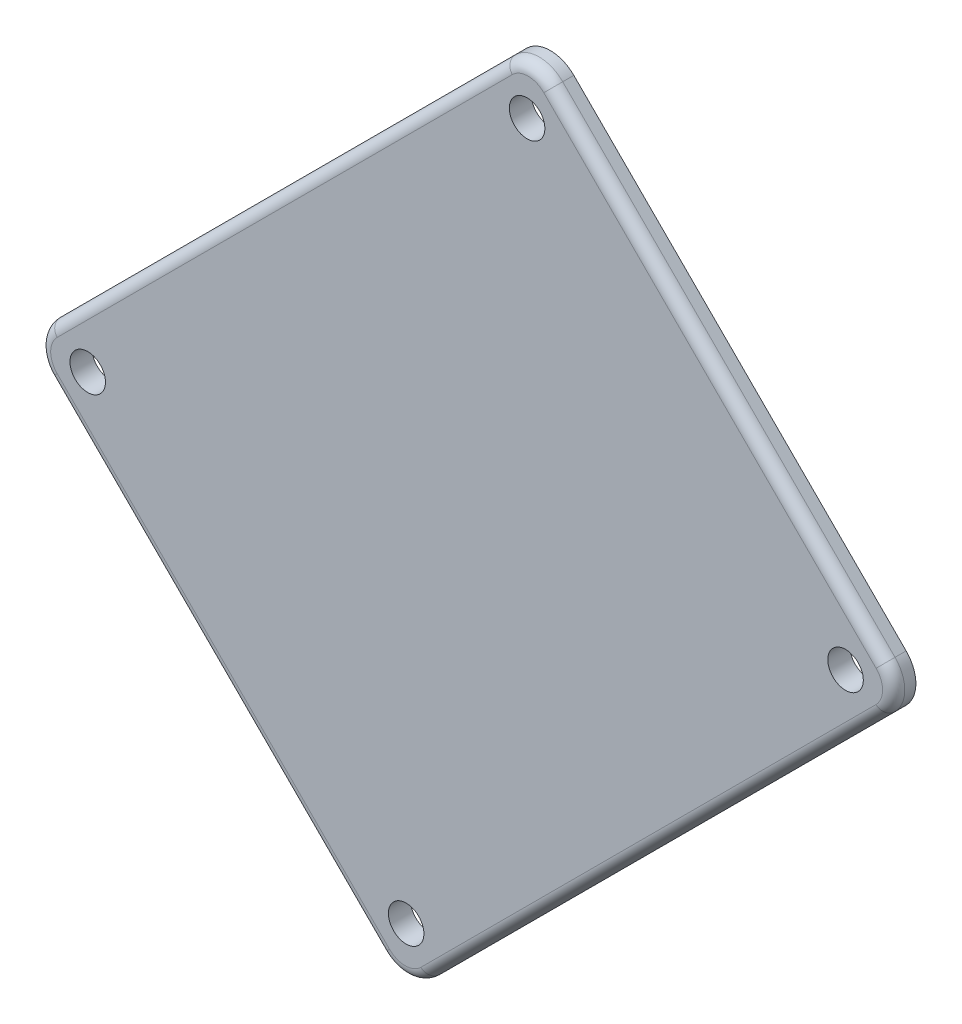
ISO-10303-21;
HEADER;
FILE_DESCRIPTION(('STEP AP214'),'2;1');
FILE_NAME('part.step','',(''),(''),'','','');
FILE_SCHEMA(('AUTOMOTIVE_DESIGN { 1 0 10303 214 1 1 1 1 }'));
ENDSEC;
DATA;
#1=APPLICATION_CONTEXT('core data for automotive mechanical design processes');
#2=APPLICATION_PROTOCOL_DEFINITION('international standard','automotive_design',2000,#1);
#3=PRODUCT_CONTEXT('',#1,'mechanical');
#4=PRODUCT('Part','Part','',(#3));
#5=PRODUCT_RELATED_PRODUCT_CATEGORY('part','',(#4));
#6=PRODUCT_DEFINITION_FORMATION('','',#4);
#7=PRODUCT_DEFINITION_CONTEXT('part definition',#1,'design');
#8=PRODUCT_DEFINITION('design','',#6,#7);
#9=PRODUCT_DEFINITION_SHAPE('','',#8);
#10=(LENGTH_UNIT() NAMED_UNIT(*) SI_UNIT(.MILLI.,.METRE.));
#11=(NAMED_UNIT(*) PLANE_ANGLE_UNIT() SI_UNIT($,.RADIAN.));
#12=(NAMED_UNIT(*) SI_UNIT($,.STERADIAN.) SOLID_ANGLE_UNIT());
#13=UNCERTAINTY_MEASURE_WITH_UNIT(LENGTH_MEASURE(1.E-05),#10,'distance_accuracy_value','');
#14=(GEOMETRIC_REPRESENTATION_CONTEXT(3) GLOBAL_UNCERTAINTY_ASSIGNED_CONTEXT((#13)) GLOBAL_UNIT_ASSIGNED_CONTEXT((#10,
#11,#12)) REPRESENTATION_CONTEXT('',''));
#15=CARTESIAN_POINT('',(0.,0.,0.));
#16=DIRECTION('',(0.,0.,1.));
#17=DIRECTION('',(1.,0.,0.));
#18=AXIS2_PLACEMENT_3D('',#15,#16,#17);
#19=CARTESIAN_POINT('',(-66.6519516090227,14.1305082810714,1.));
#20=DIRECTION('',(0.,0.,-1.));
#21=DIRECTION('',(-1.,0.,0.));
#22=AXIS2_PLACEMENT_3D('',#19,#20,#21);
#23=TOROIDAL_SURFACE('',#22,2.,1.);
#24=CARTESIAN_POINT('',(-68.0661651713958,15.5447218434445,1.));
#25=DIRECTION('',(-0.707106781186539,-0.707106781186556,0.));
#26=DIRECTION('',(0.707106781186556,-0.707106781186539,0.));
#27=AXIS2_PLACEMENT_3D('',#24,#25,#26);
#28=CIRCLE('',#27,1.);
#29=CARTESIAN_POINT('',(-68.0661651713958,15.5447218434445,2.));
#30=VERTEX_POINT('',#29);
#31=CARTESIAN_POINT('',(-68.7732719525824,16.251828624631,1.));
#32=VERTEX_POINT('',#31);
#33=EDGE_CURVE('E11',#30,#32,#28,.T.);
#34=ORIENTED_EDGE('',*,*,#33,.F.);
#35=CARTESIAN_POINT('',(-66.6519516090227,14.1305082810714,2.));
#36=DIRECTION('',(0.,0.,-1.));
#37=DIRECTION('',(-1.,0.,0.));
#38=AXIS2_PLACEMENT_3D('',#35,#36,#37);
#39=CIRCLE('',#38,2.);
#40=CARTESIAN_POINT('',(-65.2377380466496,15.5447218434445,2.));
#41=VERTEX_POINT('',#40);
#42=EDGE_CURVE('E140',#41,#30,#39,.F.);
#43=ORIENTED_EDGE('',*,*,#42,.F.);
#44=CARTESIAN_POINT('',(-65.2377380466496,15.5447218434444,1.));
#45=DIRECTION('',(-0.707106781186549,0.707106781186546,0.));
#46=DIRECTION('',(-0.707106781186546,-0.707106781186549,0.));
#47=AXIS2_PLACEMENT_3D('',#44,#45,#46);
#48=CIRCLE('',#47,1.);
#49=CARTESIAN_POINT('',(-64.5306312654631,16.251828624631,1.));
#50=VERTEX_POINT('',#49);
#51=EDGE_CURVE('E46',#41,#50,#48,.T.);
#52=ORIENTED_EDGE('',*,*,#51,.T.);
#53=CARTESIAN_POINT('',(-66.6519516090227,14.1305082810714,1.));
#54=DIRECTION('',(0.,0.,-1.));
#55=DIRECTION('',(-1.,0.,0.));
#56=AXIS2_PLACEMENT_3D('',#53,#54,#55);
#57=CIRCLE('',#56,3.);
#58=EDGE_CURVE('E232',#32,#50,#57,.T.);
#59=ORIENTED_EDGE('',*,*,#58,.F.);
#60=EDGE_LOOP('',(#34,#43,#52,#59));
#61=FACE_BOUND('',#60,.T.);
#62=ADVANCED_FACE('F39',(#61),#23,.T.);
#63=CARTESIAN_POINT('',(-65.2377380466496,15.5447218434445,1.));
#64=DIRECTION('',(-0.707106781186548,0.707106781186548,0.));
#65=DIRECTION('',(-0.707106781186548,-0.707106781186548,0.));
#66=AXIS2_PLACEMENT_3D('',#63,#64,#65);
#67=CYLINDRICAL_SURFACE('',#66,1.);
#68=ORIENTED_EDGE('',*,*,#51,.F.);
#69=DIRECTION('',(-0.707106781186548,0.707106781186548,0.));
#70=VECTOR('',#69,1.);
#71=CARTESIAN_POINT('',(-65.2377380466496,15.5447218434445,2.));
#72=LINE('',#71,#70);
#73=CARTESIAN_POINT('',(-35.2988369312113,-14.3941792719939,2.));
#74=VERTEX_POINT('',#73);
#75=EDGE_CURVE('E194',#74,#41,#72,.T.);
#76=ORIENTED_EDGE('',*,*,#75,.F.);
#77=CARTESIAN_POINT('',(-35.2988369312113,-14.3941792719939,1.));
#78=DIRECTION('',(-0.707106781186551,0.707106781186544,0.));
#79=DIRECTION('',(-0.707106781186544,-0.707106781186551,0.));
#80=AXIS2_PLACEMENT_3D('',#77,#78,#79);
#81=CIRCLE('',#80,1.);
#82=CARTESIAN_POINT('',(-34.5917301500247,-13.6870724908074,1.));
#83=VERTEX_POINT('',#82);
#84=EDGE_CURVE('E60',#74,#83,#81,.T.);
#85=ORIENTED_EDGE('',*,*,#84,.T.);
#86=DIRECTION('',(-0.707106781186548,0.707106781186548,0.));
#87=VECTOR('',#86,1.);
#88=CARTESIAN_POINT('',(-34.5917301500247,-13.6870724908074,1.));
#89=LINE('',#88,#87);
#90=EDGE_CURVE('E230',#50,#83,#89,.F.);
#91=ORIENTED_EDGE('',*,*,#90,.F.);
#92=EDGE_LOOP('',(#68,#76,#85,#91));
#93=FACE_BOUND('',#92,.T.);
#94=ADVANCED_FACE('F266',(#93),#67,.T.);
#95=CARTESIAN_POINT('',(-36.7130504935843,-15.808392834367,1.));
#96=DIRECTION('',(0.,0.,-1.));
#97=DIRECTION('',(-1.,0.,0.));
#98=AXIS2_PLACEMENT_3D('',#95,#96,#97);
#99=TOROIDAL_SURFACE('',#98,2.,1.);
#100=ORIENTED_EDGE('',*,*,#84,.F.);
#101=CARTESIAN_POINT('',(-36.7130504935843,-15.808392834367,2.));
#102=DIRECTION('',(0.,0.,-1.));
#103=DIRECTION('',(-1.,0.,0.));
#104=AXIS2_PLACEMENT_3D('',#101,#102,#103);
#105=CIRCLE('',#104,2.);
#106=CARTESIAN_POINT('',(-35.2988369312113,-17.2226063967401,2.));
#107=VERTEX_POINT('',#106);
#108=EDGE_CURVE('E197',#107,#74,#105,.F.);
#109=ORIENTED_EDGE('',*,*,#108,.F.);
#110=CARTESIAN_POINT('',(-35.2988369312113,-17.2226063967401,1.));
#111=DIRECTION('',(0.707106781186549,0.707106781186546,0.));
#112=DIRECTION('',(-0.707106781186546,0.707106781186549,0.));
#113=AXIS2_PLACEMENT_3D('',#110,#111,#112);
#114=CIRCLE('',#113,1.);
#115=CARTESIAN_POINT('',(-34.5917301500247,-17.9297131779267,1.));
#116=VERTEX_POINT('',#115);
#117=EDGE_CURVE('E242',#107,#116,#114,.T.);
#118=ORIENTED_EDGE('',*,*,#117,.T.);
#119=CARTESIAN_POINT('',(-36.7130504935843,-15.808392834367,1.));
#120=DIRECTION('',(0.,0.,-1.));
#121=DIRECTION('',(-1.,0.,0.));
#122=AXIS2_PLACEMENT_3D('',#119,#120,#121);
#123=CIRCLE('',#122,3.);
#124=EDGE_CURVE('E227',#83,#116,#123,.T.);
#125=ORIENTED_EDGE('',*,*,#124,.F.);
#126=EDGE_LOOP('',(#100,#109,#118,#125));
#127=FACE_BOUND('',#126,.T.);
#128=ADVANCED_FACE('F247',(#127),#99,.T.);
#129=CARTESIAN_POINT('',(-76.3110302400311,-58.2347997055599,1.));
#130=DIRECTION('',(0.707106781186547,0.707106781186548,0.));
#131=DIRECTION('',(-0.707106781186548,0.707106781186547,0.));
#132=AXIS2_PLACEMENT_3D('',#129,#130,#131);
#133=CYLINDRICAL_SURFACE('',#132,1.);
#134=ORIENTED_EDGE('',*,*,#117,.F.);
#135=DIRECTION('',(0.707106781186547,0.707106781186548,0.));
#136=VECTOR('',#135,1.);
#137=CARTESIAN_POINT('',(-76.3110302400311,-58.2347997055599,2.));
#138=LINE('',#137,#136);
#139=CARTESIAN_POINT('',(-76.311030240031,-58.2347997055599,2.));
#140=VERTEX_POINT('',#139);
#141=EDGE_CURVE('E200',#140,#107,#138,.T.);
#142=ORIENTED_EDGE('',*,*,#141,.F.);
#143=CARTESIAN_POINT('',(-76.311030240031,-58.2347997055599,1.));
#144=DIRECTION('',(0.707106781186548,0.707106781186548,0.));
#145=DIRECTION('',(-0.707106781186548,0.707106781186548,0.));
#146=AXIS2_PLACEMENT_3D('',#143,#144,#145);
#147=CIRCLE('',#146,1.);
#148=CARTESIAN_POINT('',(-75.6039234588445,-58.9419064867464,1.));
#149=VERTEX_POINT('',#148);
#150=EDGE_CURVE('E240',#140,#149,#147,.T.);
#151=ORIENTED_EDGE('',*,*,#150,.T.);
#152=DIRECTION('',(0.707106781186547,0.707106781186548,0.));
#153=VECTOR('',#152,1.);
#154=CARTESIAN_POINT('',(-75.6039234588445,-58.9419064867464,1.));
#155=LINE('',#154,#153);
#156=EDGE_CURVE('E224',#116,#149,#155,.F.);
#157=ORIENTED_EDGE('',*,*,#156,.F.);
#158=EDGE_LOOP('',(#134,#142,#151,#157));
#159=FACE_BOUND('',#158,.T.);
#160=ADVANCED_FACE('F255',(#159),#133,.T.);
#161=CARTESIAN_POINT('',(-77.7252438024041,-56.8205861431868,1.));
#162=DIRECTION('',(0.,0.,-1.));
#163=DIRECTION('',(-1.,0.,0.));
#164=AXIS2_PLACEMENT_3D('',#161,#162,#163);
#165=TOROIDAL_SURFACE('',#164,2.,1.);
#166=ORIENTED_EDGE('',*,*,#150,.F.);
#167=CARTESIAN_POINT('',(-77.7252438024041,-56.8205861431868,2.));
#168=DIRECTION('',(0.,0.,-1.));
#169=DIRECTION('',(-1.,0.,0.));
#170=AXIS2_PLACEMENT_3D('',#167,#168,#169);
#171=CIRCLE('',#170,2.);
#172=CARTESIAN_POINT('',(-79.1394573647772,-58.2347997055599,2.));
#173=VERTEX_POINT('',#172);
#174=EDGE_CURVE('E203',#173,#140,#171,.F.);
#175=ORIENTED_EDGE('',*,*,#174,.F.);
#176=CARTESIAN_POINT('',(-79.1394573647772,-58.2347997055599,1.));
#177=DIRECTION('',(0.707106781186548,-0.707106781186548,0.));
#178=DIRECTION('',(0.707106781186548,0.707106781186548,0.));
#179=AXIS2_PLACEMENT_3D('',#176,#177,#178);
#180=CIRCLE('',#179,1.);
#181=CARTESIAN_POINT('',(-79.8465641459638,-58.9419064867464,1.));
#182=VERTEX_POINT('',#181);
#183=EDGE_CURVE('E238',#173,#182,#180,.T.);
#184=ORIENTED_EDGE('',*,*,#183,.T.);
#185=CARTESIAN_POINT('',(-77.7252438024041,-56.8205861431868,1.));
#186=DIRECTION('',(0.,0.,-1.));
#187=DIRECTION('',(-1.,0.,0.));
#188=AXIS2_PLACEMENT_3D('',#185,#186,#187);
#189=CIRCLE('',#188,3.);
#190=EDGE_CURVE('E221',#149,#182,#189,.T.);
#191=ORIENTED_EDGE('',*,*,#190,.F.);
#192=EDGE_LOOP('',(#166,#175,#184,#191));
#193=FACE_BOUND('',#192,.T.);
#194=ADVANCED_FACE('F282',(#193),#165,.T.);
#195=CARTESIAN_POINT('',(-109.078358480216,-28.2958985901216,1.));
#196=DIRECTION('',(0.707106781186548,-0.707106781186547,0.));
#197=DIRECTION('',(0.707106781186547,0.707106781186548,0.));
#198=AXIS2_PLACEMENT_3D('',#195,#196,#197);
#199=CYLINDRICAL_SURFACE('',#198,1.);
#200=ORIENTED_EDGE('',*,*,#183,.F.);
#201=DIRECTION('',(0.707106781186548,-0.707106781186547,0.));
#202=VECTOR('',#201,1.);
#203=CARTESIAN_POINT('',(-109.078358480216,-28.2958985901216,2.));
#204=LINE('',#203,#202);
#205=CARTESIAN_POINT('',(-109.078358480216,-28.2958985901216,2.));
#206=VERTEX_POINT('',#205);
#207=EDGE_CURVE('E206',#206,#173,#204,.T.);
#208=ORIENTED_EDGE('',*,*,#207,.F.);
#209=CARTESIAN_POINT('',(-109.078358480216,-28.2958985901216,1.));
#210=DIRECTION('',(0.707106781186553,-0.707106781186542,0.));
#211=DIRECTION('',(0.707106781186542,0.707106781186553,0.));
#212=AXIS2_PLACEMENT_3D('',#209,#210,#211);
#213=CIRCLE('',#212,1.);
#214=CARTESIAN_POINT('',(-109.785465261402,-29.0030053713081,1.));
#215=VERTEX_POINT('',#214);
#216=EDGE_CURVE('E236',#206,#215,#213,.T.);
#217=ORIENTED_EDGE('',*,*,#216,.T.);
#218=DIRECTION('',(0.707106781186548,-0.707106781186547,0.));
#219=VECTOR('',#218,1.);
#220=CARTESIAN_POINT('',(-79.8465641459638,-58.9419064867464,1.));
#221=LINE('',#220,#219);
#222=EDGE_CURVE('E135',#182,#215,#221,.F.);
#223=ORIENTED_EDGE('',*,*,#222,.F.);
#224=EDGE_LOOP('',(#200,#208,#217,#223));
#225=FACE_BOUND('',#224,.T.);
#226=ADVANCED_FACE('F279',(#225),#199,.T.);
#227=CARTESIAN_POINT('',(-107.664144917843,-26.8816850277485,1.));
#228=DIRECTION('',(0.,0.,-1.));
#229=DIRECTION('',(-1.,0.,0.));
#230=AXIS2_PLACEMENT_3D('',#227,#228,#229);
#231=TOROIDAL_SURFACE('',#230,2.,1.);
#232=ORIENTED_EDGE('',*,*,#216,.F.);
#233=CARTESIAN_POINT('',(-107.664144917843,-26.8816850277485,2.));
#234=DIRECTION('',(0.,0.,-1.));
#235=DIRECTION('',(-1.,0.,0.));
#236=AXIS2_PLACEMENT_3D('',#233,#234,#235);
#237=CIRCLE('',#236,2.);
#238=CARTESIAN_POINT('',(-109.078358480216,-25.4674714653754,2.));
#239=VERTEX_POINT('',#238);
#240=EDGE_CURVE('E209',#239,#206,#237,.F.);
#241=ORIENTED_EDGE('',*,*,#240,.F.);
#242=CARTESIAN_POINT('',(-109.078358480216,-25.4674714653754,1.));
#243=DIRECTION('',(-0.707106781186549,-0.707106781186546,0.));
#244=DIRECTION('',(0.707106781186546,-0.707106781186549,0.));
#245=AXIS2_PLACEMENT_3D('',#242,#243,#244);
#246=CIRCLE('',#245,1.);
#247=CARTESIAN_POINT('',(-109.785465261402,-24.7603646841888,1.));
#248=VERTEX_POINT('',#247);
#249=EDGE_CURVE('E234',#239,#248,#246,.T.);
#250=ORIENTED_EDGE('',*,*,#249,.T.);
#251=CARTESIAN_POINT('',(-107.664144917843,-26.8816850277485,1.));
#252=DIRECTION('',(0.,0.,-1.));
#253=DIRECTION('',(-1.,0.,0.));
#254=AXIS2_PLACEMENT_3D('',#251,#252,#253);
#255=CIRCLE('',#254,3.);
#256=EDGE_CURVE('E218',#215,#248,#255,.T.);
#257=ORIENTED_EDGE('',*,*,#256,.F.);
#258=EDGE_LOOP('',(#232,#241,#250,#257));
#259=FACE_BOUND('',#258,.T.);
#260=ADVANCED_FACE('F277',(#259),#231,.T.);
#261=CARTESIAN_POINT('',(-109.078358480216,-25.4674714653754,1.));
#262=DIRECTION('',(-0.707106781186547,-0.707106781186548,0.));
#263=DIRECTION('',(0.707106781186548,-0.707106781186547,0.));
#264=AXIS2_PLACEMENT_3D('',#261,#262,#263);
#265=CYLINDRICAL_SURFACE('',#264,1.);
#266=DIRECTION('',(-0.707106781186547,-0.707106781186548,0.));
#267=VECTOR('',#266,1.);
#268=CARTESIAN_POINT('',(-109.078358480216,-25.4674714653754,2.));
#269=LINE('',#268,#267);
#270=EDGE_CURVE('E212',#30,#239,#269,.T.);
#271=ORIENTED_EDGE('',*,*,#270,.F.);
#272=ORIENTED_EDGE('',*,*,#33,.T.);
#273=DIRECTION('',(-0.707106781186547,-0.707106781186548,0.));
#274=VECTOR('',#273,1.);
#275=CARTESIAN_POINT('',(-109.785465261402,-24.7603646841888,1.));
#276=LINE('',#275,#274);
#277=EDGE_CURVE('E215',#248,#32,#276,.F.);
#278=ORIENTED_EDGE('',*,*,#277,.F.);
#279=ORIENTED_EDGE('',*,*,#249,.F.);
#280=EDGE_LOOP('',(#271,#272,#278,#279));
#281=FACE_BOUND('',#280,.T.);
#282=ADVANCED_FACE('F273',(#281),#265,.T.);
#283=CARTESIAN_POINT('',(-107.664144917843,-26.8816850277485,2.));
#284=DIRECTION('',(0.,0.,-1.));
#285=DIRECTION('',(-1.,0.,0.));
#286=AXIS2_PLACEMENT_3D('',#283,#284,#285);
#287=CYLINDRICAL_SURFACE('',#286,3.);
#288=DIRECTION('',(0.,0.,-1.));
#289=VECTOR('',#288,1.);
#290=CARTESIAN_POINT('',(-109.785465261402,-29.0030053713081,2.));
#291=LINE('',#290,#289);
#292=CARTESIAN_POINT('',(-109.785465261402,-29.0030053713081,0.));
#293=VERTEX_POINT('',#292);
#294=EDGE_CURVE('E128',#215,#293,#291,.T.);
#295=ORIENTED_EDGE('',*,*,#294,.F.);
#296=ORIENTED_EDGE('',*,*,#256,.T.);
#297=DIRECTION('',(0.,0.,-1.));
#298=VECTOR('',#297,1.);
#299=CARTESIAN_POINT('',(-109.785465261402,-24.7603646841888,2.));
#300=LINE('',#299,#298);
#301=CARTESIAN_POINT('',(-109.785465261402,-24.7603646841888,0.));
#302=VERTEX_POINT('',#301);
#303=EDGE_CURVE('E154',#248,#302,#300,.T.);
#304=ORIENTED_EDGE('',*,*,#303,.T.);
#305=CARTESIAN_POINT('',(-107.664144917843,-26.8816850277485,0.));
#306=DIRECTION('',(0.,0.,1.));
#307=DIRECTION('',(-1.,0.,0.));
#308=AXIS2_PLACEMENT_3D('',#305,#306,#307);
#309=CIRCLE('',#308,3.);
#310=EDGE_CURVE('E147',#302,#293,#309,.T.);
#311=ORIENTED_EDGE('',*,*,#310,.T.);
#312=EDGE_LOOP('',(#295,#296,#304,#311));
#313=FACE_BOUND('',#312,.T.);
#314=ADVANCED_FACE('F152',(#313),#287,.T.);
#315=CARTESIAN_POINT('',(-79.8465641459638,-58.9419064867464,2.));
#316=DIRECTION('',(0.707106781186547,0.707106781186548,0.));
#317=DIRECTION('',(-0.707106781186548,0.707106781186547,0.));
#318=AXIS2_PLACEMENT_3D('',#315,#316,#317);
#319=PLANE('',#318);
#320=DIRECTION('',(0.,0.,-1.));
#321=VECTOR('',#320,1.);
#322=CARTESIAN_POINT('',(-79.8465641459638,-58.9419064867464,2.));
#323=LINE('',#322,#321);
#324=CARTESIAN_POINT('',(-79.8465641459638,-58.9419064867464,0.));
#325=VERTEX_POINT('',#324);
#326=EDGE_CURVE('E141',#182,#325,#323,.T.);
#327=ORIENTED_EDGE('',*,*,#326,.F.);
#328=ORIENTED_EDGE('',*,*,#222,.T.);
#329=ORIENTED_EDGE('',*,*,#294,.T.);
#330=DIRECTION('',(0.707106781186548,-0.707106781186547,0.));
#331=VECTOR('',#330,1.);
#332=CARTESIAN_POINT('',(-79.8465641459638,-58.9419064867464,0.));
#333=LINE('',#332,#331);
#334=EDGE_CURVE('E132',#293,#325,#333,.T.);
#335=ORIENTED_EDGE('',*,*,#334,.T.);
#336=EDGE_LOOP('',(#327,#328,#329,#335));
#337=FACE_BOUND('',#336,.T.);
#338=ADVANCED_FACE('F131',(#337),#319,.F.);
#339=CARTESIAN_POINT('',(-77.7252438024041,-56.8205861431868,2.));
#340=DIRECTION('',(0.,0.,-1.));
#341=DIRECTION('',(-1.,0.,0.));
#342=AXIS2_PLACEMENT_3D('',#339,#340,#341);
#343=CYLINDRICAL_SURFACE('',#342,3.);
#344=DIRECTION('',(0.,0.,-1.));
#345=VECTOR('',#344,1.);
#346=CARTESIAN_POINT('',(-75.6039234588445,-58.9419064867464,2.));
#347=LINE('',#346,#345);
#348=CARTESIAN_POINT('',(-75.6039234588445,-58.9419064867464,0.));
#349=VERTEX_POINT('',#348);
#350=EDGE_CURVE('E189',#149,#349,#347,.T.);
#351=ORIENTED_EDGE('',*,*,#350,.F.);
#352=ORIENTED_EDGE('',*,*,#190,.T.);
#353=ORIENTED_EDGE('',*,*,#326,.T.);
#354=CARTESIAN_POINT('',(-77.7252438024041,-56.8205861431868,0.));
#355=DIRECTION('',(0.,0.,1.));
#356=DIRECTION('',(1.,0.,0.));
#357=AXIS2_PLACEMENT_3D('',#354,#355,#356);
#358=CIRCLE('',#357,3.);
#359=EDGE_CURVE('E150',#325,#349,#358,.T.);
#360=ORIENTED_EDGE('',*,*,#359,.T.);
#361=EDGE_LOOP('',(#351,#352,#353,#360));
#362=FACE_BOUND('',#361,.T.);
#363=ADVANCED_FACE('F284',(#362),#343,.T.);
#364=CARTESIAN_POINT('',(-75.6039234588445,-58.9419064867464,2.));
#365=DIRECTION('',(-0.707106781186548,0.707106781186547,0.));
#366=DIRECTION('',(-0.707106781186547,-0.707106781186548,0.));
#367=AXIS2_PLACEMENT_3D('',#364,#365,#366);
#368=PLANE('',#367);
#369=DIRECTION('',(0.,0.,-1.));
#370=VECTOR('',#369,1.);
#371=CARTESIAN_POINT('',(-34.5917301500247,-17.9297131779267,2.));
#372=LINE('',#371,#370);
#373=CARTESIAN_POINT('',(-34.5917301500247,-17.9297131779267,0.));
#374=VERTEX_POINT('',#373);
#375=EDGE_CURVE('E187',#116,#374,#372,.T.);
#376=ORIENTED_EDGE('',*,*,#375,.F.);
#377=ORIENTED_EDGE('',*,*,#156,.T.);
#378=ORIENTED_EDGE('',*,*,#350,.T.);
#379=DIRECTION('',(0.707106781186547,0.707106781186548,0.));
#380=VECTOR('',#379,1.);
#381=CARTESIAN_POINT('',(-75.6039234588445,-58.9419064867464,0.));
#382=LINE('',#381,#380);
#383=EDGE_CURVE('E166',#349,#374,#382,.T.);
#384=ORIENTED_EDGE('',*,*,#383,.T.);
#385=EDGE_LOOP('',(#376,#377,#378,#384));
#386=FACE_BOUND('',#385,.T.);
#387=ADVANCED_FACE('F258',(#386),#368,.F.);
#388=CARTESIAN_POINT('',(-36.7130504935843,-15.808392834367,2.));
#389=DIRECTION('',(0.,0.,-1.));
#390=DIRECTION('',(-1.,0.,0.));
#391=AXIS2_PLACEMENT_3D('',#388,#389,#390);
#392=CYLINDRICAL_SURFACE('',#391,3.);
#393=DIRECTION('',(0.,0.,-1.));
#394=VECTOR('',#393,1.);
#395=CARTESIAN_POINT('',(-34.5917301500247,-13.6870724908074,2.));
#396=LINE('',#395,#394);
#397=CARTESIAN_POINT('',(-34.5917301500247,-13.6870724908074,0.));
#398=VERTEX_POINT('',#397);
#399=EDGE_CURVE('E185',#83,#398,#396,.T.);
#400=ORIENTED_EDGE('',*,*,#399,.F.);
#401=ORIENTED_EDGE('',*,*,#124,.T.);
#402=ORIENTED_EDGE('',*,*,#375,.T.);
#403=CARTESIAN_POINT('',(-36.7130504935843,-15.808392834367,0.));
#404=DIRECTION('',(0.,0.,1.));
#405=DIRECTION('',(1.,0.,0.));
#406=AXIS2_PLACEMENT_3D('',#403,#404,#405);
#407=CIRCLE('',#406,3.);
#408=EDGE_CURVE('E169',#374,#398,#407,.T.);
#409=ORIENTED_EDGE('',*,*,#408,.T.);
#410=EDGE_LOOP('',(#400,#401,#402,#409));
#411=FACE_BOUND('',#410,.T.);
#412=ADVANCED_FACE('F253',(#411),#392,.T.);
#413=CARTESIAN_POINT('',(-34.5917301500247,-13.6870724908074,2.));
#414=DIRECTION('',(-0.707106781186547,-0.707106781186547,0.));
#415=DIRECTION('',(0.707106781186548,-0.707106781186548,0.));
#416=AXIS2_PLACEMENT_3D('',#413,#414,#415);
#417=PLANE('',#416);
#418=DIRECTION('',(0.,0.,-1.));
#419=VECTOR('',#418,1.);
#420=CARTESIAN_POINT('',(-64.5306312654631,16.251828624631,2.));
#421=LINE('',#420,#419);
#422=CARTESIAN_POINT('',(-64.5306312654631,16.251828624631,0.));
#423=VERTEX_POINT('',#422);
#424=EDGE_CURVE('E183',#50,#423,#421,.T.);
#425=ORIENTED_EDGE('',*,*,#424,.F.);
#426=ORIENTED_EDGE('',*,*,#90,.T.);
#427=ORIENTED_EDGE('',*,*,#399,.T.);
#428=DIRECTION('',(-0.707106781186548,0.707106781186548,0.));
#429=VECTOR('',#428,1.);
#430=CARTESIAN_POINT('',(-34.5917301500247,-13.6870724908074,0.));
#431=LINE('',#430,#429);
#432=EDGE_CURVE('E172',#398,#423,#431,.T.);
#433=ORIENTED_EDGE('',*,*,#432,.T.);
#434=EDGE_LOOP('',(#425,#426,#427,#433));
#435=FACE_BOUND('',#434,.T.);
#436=ADVANCED_FACE('F265',(#435),#417,.F.);
#437=CARTESIAN_POINT('',(-66.6519516090227,14.1305082810714,2.));
#438=DIRECTION('',(0.,0.,-1.));
#439=DIRECTION('',(-1.,0.,0.));
#440=AXIS2_PLACEMENT_3D('',#437,#438,#439);
#441=CYLINDRICAL_SURFACE('',#440,3.);
#442=DIRECTION('',(0.,0.,-1.));
#443=VECTOR('',#442,1.);
#444=CARTESIAN_POINT('',(-68.7732719525824,16.251828624631,2.));
#445=LINE('',#444,#443);
#446=CARTESIAN_POINT('',(-68.7732719525824,16.251828624631,0.));
#447=VERTEX_POINT('',#446);
#448=EDGE_CURVE('E181',#32,#447,#445,.T.);
#449=ORIENTED_EDGE('',*,*,#448,.F.);
#450=ORIENTED_EDGE('',*,*,#58,.T.);
#451=ORIENTED_EDGE('',*,*,#424,.T.);
#452=CARTESIAN_POINT('',(-66.6519516090227,14.1305082810714,0.));
#453=DIRECTION('',(0.,0.,1.));
#454=DIRECTION('',(1.,0.,0.));
#455=AXIS2_PLACEMENT_3D('',#452,#453,#454);
#456=CIRCLE('',#455,3.);
#457=EDGE_CURVE('E175',#423,#447,#456,.T.);
#458=ORIENTED_EDGE('',*,*,#457,.T.);
#459=EDGE_LOOP('',(#449,#450,#451,#458));
#460=FACE_BOUND('',#459,.T.);
#461=ADVANCED_FACE('F351',(#460),#441,.T.);
#462=CARTESIAN_POINT('',(-109.785465261402,-24.7603646841888,2.));
#463=DIRECTION('',(0.707106781186548,-0.707106781186547,0.));
#464=DIRECTION('',(0.707106781186547,0.707106781186548,0.));
#465=AXIS2_PLACEMENT_3D('',#462,#463,#464);
#466=PLANE('',#465);
#467=ORIENTED_EDGE('',*,*,#303,.F.);
#468=ORIENTED_EDGE('',*,*,#277,.T.);
#469=ORIENTED_EDGE('',*,*,#448,.T.);
#470=DIRECTION('',(-0.707106781186547,-0.707106781186548,0.));
#471=VECTOR('',#470,1.);
#472=CARTESIAN_POINT('',(-109.785465261402,-24.7603646841888,0.));
#473=LINE('',#472,#471);
#474=EDGE_CURVE('E178',#447,#302,#473,.T.);
#475=ORIENTED_EDGE('',*,*,#474,.T.);
#476=EDGE_LOOP('',(#467,#468,#469,#475));
#477=FACE_BOUND('',#476,.T.);
#478=ADVANCED_FACE('F360',(#477),#466,.F.);
#479=CARTESIAN_POINT('',(-107.664144917843,-26.8816850277485,2.));
#480=DIRECTION('',(0.,0.,-1.));
#481=DIRECTION('',(-1.,0.,0.));
#482=AXIS2_PLACEMENT_3D('',#479,#480,#481);
#483=PLANE('',#482);
#484=ORIENTED_EDGE('',*,*,#42,.T.);
#485=ORIENTED_EDGE('',*,*,#270,.T.);
#486=ORIENTED_EDGE('',*,*,#240,.T.);
#487=ORIENTED_EDGE('',*,*,#207,.T.);
#488=ORIENTED_EDGE('',*,*,#174,.T.);
#489=ORIENTED_EDGE('',*,*,#141,.T.);
#490=ORIENTED_EDGE('',*,*,#108,.T.);
#491=ORIENTED_EDGE('',*,*,#75,.T.);
#492=EDGE_LOOP('',(#484,#485,#486,#487,#488,#489,#490,#491));
#493=FACE_BOUND('',#492,.T.);
#494=CARTESIAN_POINT('',(-106.329000574649,-26.7940588149206,2.));
#495=DIRECTION('',(0.,0.,1.));
#496=DIRECTION('',(1.,0.,0.));
#497=AXIS2_PLACEMENT_3D('',#494,#495,#496);
#498=CIRCLE('',#497,1.6);
#499=CARTESIAN_POINT('',(-104.729000574649,-26.7940588149206,2.));
#500=VERTEX_POINT('',#499);
#501=EDGE_CURVE('E156',#500,#500,#498,.T.);
#502=ORIENTED_EDGE('',*,*,#501,.F.);
#503=EDGE_LOOP('',(#502));
#504=FACE_BOUND('',#503,.T.);
#505=CARTESIAN_POINT('',(-77.6376175895763,-55.4854417999937,2.));
#506=DIRECTION('',(0.,0.,1.));
#507=DIRECTION('',(-1.,0.,0.));
#508=AXIS2_PLACEMENT_3D('',#505,#506,#507);
#509=CIRCLE('',#508,1.59999999999996);
#510=CARTESIAN_POINT('',(-79.2376175895763,-55.4854417999937,2.));
#511=VERTEX_POINT('',#510);
#512=EDGE_CURVE('E479',#511,#511,#509,.T.);
#513=ORIENTED_EDGE('',*,*,#512,.F.);
#514=EDGE_LOOP('',(#513));
#515=FACE_BOUND('',#514,.T.);
#516=CARTESIAN_POINT('',(-38.0481948367775,-15.8960190471948,2.));
#517=DIRECTION('',(0.,0.,1.));
#518=DIRECTION('',(1.,0.,0.));
#519=AXIS2_PLACEMENT_3D('',#516,#517,#518);
#520=CIRCLE('',#519,1.59999999999997);
#521=CARTESIAN_POINT('',(-36.4481948367775,-15.8960190471948,2.));
#522=VERTEX_POINT('',#521);
#523=EDGE_CURVE('E483',#522,#522,#520,.T.);
#524=ORIENTED_EDGE('',*,*,#523,.F.);
#525=EDGE_LOOP('',(#524));
#526=FACE_BOUND('',#525,.T.);
#527=CARTESIAN_POINT('',(-66.7395778218506,12.7953639378783,2.));
#528=DIRECTION('',(0.,0.,1.));
#529=DIRECTION('',(-1.,0.,0.));
#530=AXIS2_PLACEMENT_3D('',#527,#528,#529);
#531=CIRCLE('',#530,1.60000000000001);
#532=CARTESIAN_POINT('',(-68.3395778218506,12.7953639378783,2.));
#533=VERTEX_POINT('',#532);
#534=EDGE_CURVE('E162',#533,#533,#531,.T.);
#535=ORIENTED_EDGE('',*,*,#534,.F.);
#536=EDGE_LOOP('',(#535));
#537=FACE_BOUND('',#536,.T.);
#538=ADVANCED_FACE('F268',(#493,#504,#515,#526,#537),#483,.F.);
#539=CARTESIAN_POINT('',(-107.664144917843,-26.8816850277485,0.));
#540=DIRECTION('',(0.,0.,-1.));
#541=DIRECTION('',(-1.,0.,0.));
#542=AXIS2_PLACEMENT_3D('',#539,#540,#541);
#543=PLANE('',#542);
#544=CARTESIAN_POINT('',(-106.329000574649,-26.7940588149206,0.));
#545=DIRECTION('',(0.,0.,-1.));
#546=DIRECTION('',(-1.,0.,0.));
#547=AXIS2_PLACEMENT_3D('',#544,#545,#546);
#548=CIRCLE('',#547,1.6);
#549=CARTESIAN_POINT('',(-107.929000574649,-26.7940588149206,0.));
#550=VERTEX_POINT('',#549);
#551=EDGE_CURVE('E159',#550,#550,#548,.F.);
#552=ORIENTED_EDGE('',*,*,#551,.T.);
#553=EDGE_LOOP('',(#552));
#554=FACE_BOUND('',#553,.T.);
#555=CARTESIAN_POINT('',(-77.6376175895763,-55.4854417999937,0.));
#556=DIRECTION('',(0.,0.,-1.));
#557=DIRECTION('',(-1.,0.,0.));
#558=AXIS2_PLACEMENT_3D('',#555,#556,#557);
#559=CIRCLE('',#558,1.59999999999996);
#560=CARTESIAN_POINT('',(-79.2376175895763,-55.4854417999937,0.));
#561=VERTEX_POINT('',#560);
#562=EDGE_CURVE('E497',#561,#561,#559,.F.);
#563=ORIENTED_EDGE('',*,*,#562,.T.);
#564=EDGE_LOOP('',(#563));
#565=FACE_BOUND('',#564,.T.);
#566=CARTESIAN_POINT('',(-38.0481948367775,-15.8960190471948,0.));
#567=DIRECTION('',(0.,0.,-1.));
#568=DIRECTION('',(-1.,0.,0.));
#569=AXIS2_PLACEMENT_3D('',#566,#567,#568);
#570=CIRCLE('',#569,1.59999999999997);
#571=CARTESIAN_POINT('',(-39.6481948367774,-15.8960190471948,0.));
#572=VERTEX_POINT('',#571);
#573=EDGE_CURVE('E491',#572,#572,#570,.F.);
#574=ORIENTED_EDGE('',*,*,#573,.T.);
#575=EDGE_LOOP('',(#574));
#576=FACE_BOUND('',#575,.T.);
#577=CARTESIAN_POINT('',(-66.7395778218506,12.7953639378783,0.));
#578=DIRECTION('',(0.,0.,-1.));
#579=DIRECTION('',(-1.,0.,0.));
#580=AXIS2_PLACEMENT_3D('',#577,#578,#579);
#581=CIRCLE('',#580,1.60000000000001);
#582=CARTESIAN_POINT('',(-68.3395778218506,12.7953639378783,0.));
#583=VERTEX_POINT('',#582);
#584=EDGE_CURVE('E487',#583,#583,#581,.F.);
#585=ORIENTED_EDGE('',*,*,#584,.T.);
#586=EDGE_LOOP('',(#585));
#587=FACE_BOUND('',#586,.T.);
#588=ORIENTED_EDGE('',*,*,#310,.F.);
#589=ORIENTED_EDGE('',*,*,#474,.F.);
#590=ORIENTED_EDGE('',*,*,#457,.F.);
#591=ORIENTED_EDGE('',*,*,#432,.F.);
#592=ORIENTED_EDGE('',*,*,#408,.F.);
#593=ORIENTED_EDGE('',*,*,#383,.F.);
#594=ORIENTED_EDGE('',*,*,#359,.F.);
#595=ORIENTED_EDGE('',*,*,#334,.F.);
#596=EDGE_LOOP('',(#588,#589,#590,#591,#592,#593,#594,#595));
#597=FACE_BOUND('',#596,.T.);
#598=ADVANCED_FACE('F145',(#554,#565,#576,#587,#597),#543,.T.);
#599=CARTESIAN_POINT('',(-66.7395778218506,12.7953639378783,-0.00100000000000013));
#600=DIRECTION('',(0.,0.,1.));
#601=DIRECTION('',(1.,0.,0.));
#602=AXIS2_PLACEMENT_3D('',#599,#600,#601);
#603=CYLINDRICAL_SURFACE('',#602,1.60000000000001);
#604=ORIENTED_EDGE('',*,*,#584,.F.);
#605=EDGE_LOOP('',(#604));
#606=FACE_BOUND('',#605,.T.);
#607=ORIENTED_EDGE('',*,*,#534,.T.);
#608=EDGE_LOOP('',(#607));
#609=FACE_BOUND('',#608,.T.);
#610=ADVANCED_FACE('F387',(#606,#609),#603,.F.);
#611=CARTESIAN_POINT('',(-38.0481948367775,-15.8960190471948,-0.00100000000000013));
#612=DIRECTION('',(0.,0.,1.));
#613=DIRECTION('',(1.,0.,0.));
#614=AXIS2_PLACEMENT_3D('',#611,#612,#613);
#615=CYLINDRICAL_SURFACE('',#614,1.59999999999997);
#616=ORIENTED_EDGE('',*,*,#573,.F.);
#617=EDGE_LOOP('',(#616));
#618=FACE_BOUND('',#617,.T.);
#619=ORIENTED_EDGE('',*,*,#523,.T.);
#620=EDGE_LOOP('',(#619));
#621=FACE_BOUND('',#620,.T.);
#622=ADVANCED_FACE('F397',(#618,#621),#615,.F.);
#623=CARTESIAN_POINT('',(-77.6376175895763,-55.4854417999937,-0.00100000000000013));
#624=DIRECTION('',(0.,0.,1.));
#625=DIRECTION('',(1.,0.,0.));
#626=AXIS2_PLACEMENT_3D('',#623,#624,#625);
#627=CYLINDRICAL_SURFACE('',#626,1.59999999999996);
#628=ORIENTED_EDGE('',*,*,#562,.F.);
#629=EDGE_LOOP('',(#628));
#630=FACE_BOUND('',#629,.T.);
#631=ORIENTED_EDGE('',*,*,#512,.T.);
#632=EDGE_LOOP('',(#631));
#633=FACE_BOUND('',#632,.T.);
#634=ADVANCED_FACE('F407',(#630,#633),#627,.F.);
#635=CARTESIAN_POINT('',(-106.329000574649,-26.7940588149206,-0.00100000000000013));
#636=DIRECTION('',(0.,0.,1.));
#637=DIRECTION('',(1.,0.,0.));
#638=AXIS2_PLACEMENT_3D('',#635,#636,#637);
#639=CYLINDRICAL_SURFACE('',#638,1.6);
#640=ORIENTED_EDGE('',*,*,#551,.F.);
#641=EDGE_LOOP('',(#640));
#642=FACE_BOUND('',#641,.T.);
#643=ORIENTED_EDGE('',*,*,#501,.T.);
#644=EDGE_LOOP('',(#643));
#645=FACE_BOUND('',#644,.T.);
#646=ADVANCED_FACE('F417',(#642,#645),#639,.F.);
#647=CLOSED_SHELL('',(#62,#94,#128,#160,#194,#226,#260,#282,#314,#338,#363,#387,#412,#436,#461,
#478,#538,#598,#610,#622,#634,#646));
#648=MANIFOLD_SOLID_BREP('B2',#647);
#649=ADVANCED_BREP_SHAPE_REPRESENTATION('',(#18,#648),#14);
#650=SHAPE_DEFINITION_REPRESENTATION(#9,#649);
ENDSEC;
END-ISO-10303-21;
